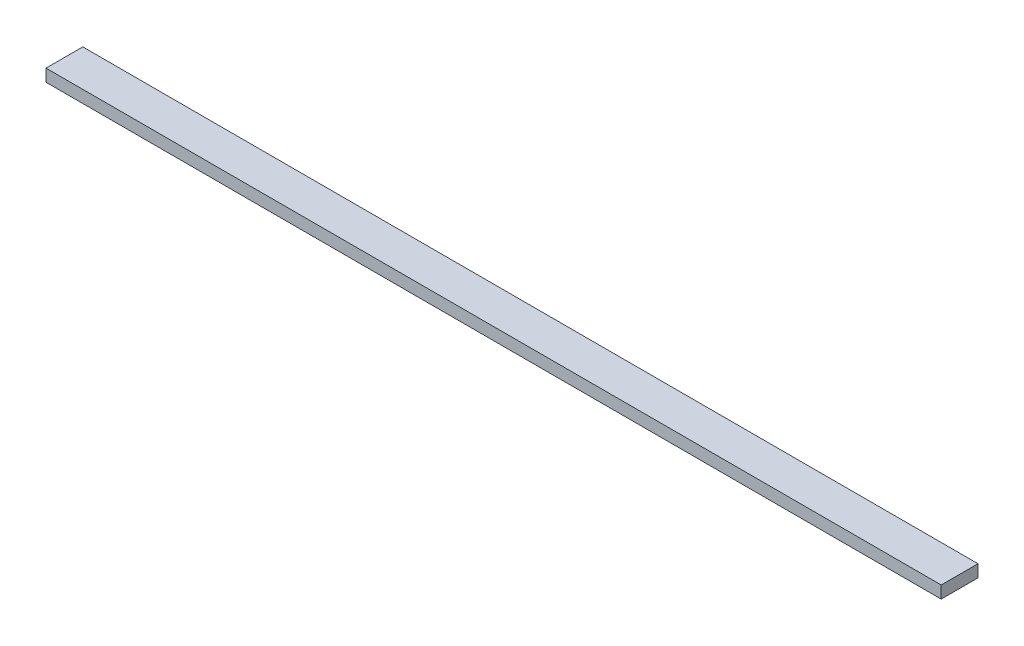
ISO-10303-21;
HEADER;
FILE_DESCRIPTION(('STEP AP214'),'2;1');
FILE_NAME('part.step','',(''),(''),'','','');
FILE_SCHEMA(('AUTOMOTIVE_DESIGN { 1 0 10303 214 1 1 1 1 }'));
ENDSEC;
DATA;
#1=APPLICATION_CONTEXT('core data for automotive mechanical design processes');
#2=APPLICATION_PROTOCOL_DEFINITION('international standard','automotive_design',2000,#1);
#3=PRODUCT_CONTEXT('',#1,'mechanical');
#4=PRODUCT('Part','Part','',(#3));
#5=PRODUCT_RELATED_PRODUCT_CATEGORY('part','',(#4));
#6=PRODUCT_DEFINITION_FORMATION('','',#4);
#7=PRODUCT_DEFINITION_CONTEXT('part definition',#1,'design');
#8=PRODUCT_DEFINITION('design','',#6,#7);
#9=PRODUCT_DEFINITION_SHAPE('','',#8);
#10=(LENGTH_UNIT() NAMED_UNIT(*) SI_UNIT(.MILLI.,.METRE.));
#11=(NAMED_UNIT(*) PLANE_ANGLE_UNIT() SI_UNIT($,.RADIAN.));
#12=(NAMED_UNIT(*) SI_UNIT($,.STERADIAN.) SOLID_ANGLE_UNIT());
#13=UNCERTAINTY_MEASURE_WITH_UNIT(LENGTH_MEASURE(1.E-05),#10,'distance_accuracy_value','');
#14=(GEOMETRIC_REPRESENTATION_CONTEXT(3) GLOBAL_UNCERTAINTY_ASSIGNED_CONTEXT((#13)) GLOBAL_UNIT_ASSIGNED_CONTEXT((#10,
#11,#12)) REPRESENTATION_CONTEXT('',''));
#15=CARTESIAN_POINT('',(0.,0.,0.));
#16=DIRECTION('',(0.,0.,1.));
#17=DIRECTION('',(1.,0.,0.));
#18=AXIS2_PLACEMENT_3D('',#15,#16,#17);
#19=CARTESIAN_POINT('',(0.,12.7,0.));
#20=DIRECTION('',(1.,0.,0.));
#21=DIRECTION('',(0.,0.,-1.));
#22=AXIS2_PLACEMENT_3D('',#19,#20,#21);
#23=PLANE('',#22);
#24=DIRECTION('',(0.,0.,1.));
#25=VECTOR('',#24,1.);
#26=CARTESIAN_POINT('',(0.,0.,0.));
#27=LINE('',#26,#25);
#28=CARTESIAN_POINT('',(0.,0.,-38.1));
#29=VERTEX_POINT('',#28);
#30=CARTESIAN_POINT('',(0.,0.,0.));
#31=VERTEX_POINT('',#30);
#32=EDGE_CURVE('E97',#29,#31,#27,.T.);
#33=ORIENTED_EDGE('',*,*,#32,.T.);
#34=DIRECTION('',(0.,-1.,0.));
#35=VECTOR('',#34,1.);
#36=CARTESIAN_POINT('',(0.,12.7,0.));
#37=LINE('',#36,#35);
#38=CARTESIAN_POINT('',(0.,12.7,0.));
#39=VERTEX_POINT('',#38);
#40=EDGE_CURVE('E11',#39,#31,#37,.T.);
#41=ORIENTED_EDGE('',*,*,#40,.F.);
#42=DIRECTION('',(0.,0.,1.));
#43=VECTOR('',#42,1.);
#44=CARTESIAN_POINT('',(0.,12.7,0.));
#45=LINE('',#44,#43);
#46=CARTESIAN_POINT('',(0.,12.7,-38.1));
#47=VERTEX_POINT('',#46);
#48=EDGE_CURVE('E85',#47,#39,#45,.T.);
#49=ORIENTED_EDGE('',*,*,#48,.F.);
#50=DIRECTION('',(0.,-1.,0.));
#51=VECTOR('',#50,1.);
#52=CARTESIAN_POINT('',(0.,12.7,-38.1));
#53=LINE('',#52,#51);
#54=EDGE_CURVE('E93',#47,#29,#53,.T.);
#55=ORIENTED_EDGE('',*,*,#54,.T.);
#56=EDGE_LOOP('',(#33,#41,#49,#55));
#57=FACE_BOUND('',#56,.T.);
#58=ADVANCED_FACE('F34',(#57),#23,.F.);
#59=CARTESIAN_POINT('',(0.,12.7,0.));
#60=DIRECTION('',(0.,0.,-1.));
#61=DIRECTION('',(-1.,0.,0.));
#62=AXIS2_PLACEMENT_3D('',#59,#60,#61);
#63=PLANE('',#62);
#64=DIRECTION('',(1.,0.,0.));
#65=VECTOR('',#64,1.);
#66=CARTESIAN_POINT('',(0.,0.,0.));
#67=LINE('',#66,#65);
#68=CARTESIAN_POINT('',(927.1,0.,0.));
#69=VERTEX_POINT('',#68);
#70=EDGE_CURVE('E89',#31,#69,#67,.T.);
#71=ORIENTED_EDGE('',*,*,#70,.T.);
#72=DIRECTION('',(0.,-1.,0.));
#73=VECTOR('',#72,1.);
#74=CARTESIAN_POINT('',(927.1,12.7,0.));
#75=LINE('',#74,#73);
#76=CARTESIAN_POINT('',(927.1,12.7,0.));
#77=VERTEX_POINT('',#76);
#78=EDGE_CURVE('E42',#77,#69,#75,.T.);
#79=ORIENTED_EDGE('',*,*,#78,.F.);
#80=DIRECTION('',(1.,0.,0.));
#81=VECTOR('',#80,1.);
#82=CARTESIAN_POINT('',(0.,12.7,0.));
#83=LINE('',#82,#81);
#84=EDGE_CURVE('E80',#39,#77,#83,.T.);
#85=ORIENTED_EDGE('',*,*,#84,.F.);
#86=ORIENTED_EDGE('',*,*,#40,.T.);
#87=EDGE_LOOP('',(#71,#79,#85,#86));
#88=FACE_BOUND('',#87,.T.);
#89=ADVANCED_FACE('F88',(#88),#63,.F.);
#90=CARTESIAN_POINT('',(927.1,12.7,0.));
#91=DIRECTION('',(-1.,0.,0.));
#92=DIRECTION('',(0.,0.,1.));
#93=AXIS2_PLACEMENT_3D('',#90,#91,#92);
#94=PLANE('',#93);
#95=DIRECTION('',(0.,0.,-1.));
#96=VECTOR('',#95,1.);
#97=CARTESIAN_POINT('',(927.1,0.,0.));
#98=LINE('',#97,#96);
#99=CARTESIAN_POINT('',(927.1,0.,-38.1));
#100=VERTEX_POINT('',#99);
#101=EDGE_CURVE('E67',#69,#100,#98,.T.);
#102=ORIENTED_EDGE('',*,*,#101,.T.);
#103=DIRECTION('',(0.,-1.,0.));
#104=VECTOR('',#103,1.);
#105=CARTESIAN_POINT('',(927.1,12.7,-38.1));
#106=LINE('',#105,#104);
#107=CARTESIAN_POINT('',(927.1,12.7,-38.1));
#108=VERTEX_POINT('',#107);
#109=EDGE_CURVE('E90',#108,#100,#106,.T.);
#110=ORIENTED_EDGE('',*,*,#109,.F.);
#111=DIRECTION('',(0.,0.,-1.));
#112=VECTOR('',#111,1.);
#113=CARTESIAN_POINT('',(927.1,12.7,0.));
#114=LINE('',#113,#112);
#115=EDGE_CURVE('E83',#77,#108,#114,.T.);
#116=ORIENTED_EDGE('',*,*,#115,.F.);
#117=ORIENTED_EDGE('',*,*,#78,.T.);
#118=EDGE_LOOP('',(#102,#110,#116,#117));
#119=FACE_BOUND('',#118,.T.);
#120=ADVANCED_FACE('F91',(#119),#94,.F.);
#121=CARTESIAN_POINT('',(0.,12.7,-38.1));
#122=DIRECTION('',(0.,0.,1.));
#123=DIRECTION('',(1.,0.,0.));
#124=AXIS2_PLACEMENT_3D('',#121,#122,#123);
#125=PLANE('',#124);
#126=DIRECTION('',(-1.,0.,0.));
#127=VECTOR('',#126,1.);
#128=CARTESIAN_POINT('',(0.,0.,-38.1));
#129=LINE('',#128,#127);
#130=EDGE_CURVE('E73',#100,#29,#129,.T.);
#131=ORIENTED_EDGE('',*,*,#130,.T.);
#132=ORIENTED_EDGE('',*,*,#54,.F.);
#133=DIRECTION('',(-1.,0.,0.));
#134=VECTOR('',#133,1.);
#135=CARTESIAN_POINT('',(0.,12.7,-38.1));
#136=LINE('',#135,#134);
#137=EDGE_CURVE('E50',#108,#47,#136,.T.);
#138=ORIENTED_EDGE('',*,*,#137,.F.);
#139=ORIENTED_EDGE('',*,*,#109,.T.);
#140=EDGE_LOOP('',(#131,#132,#138,#139));
#141=FACE_BOUND('',#140,.T.);
#142=ADVANCED_FACE('F104',(#141),#125,.F.);
#143=CARTESIAN_POINT('',(0.,12.7,0.));
#144=DIRECTION('',(0.,-1.,0.));
#145=DIRECTION('',(0.,0.,-1.));
#146=AXIS2_PLACEMENT_3D('',#143,#144,#145);
#147=PLANE('',#146);
#148=ORIENTED_EDGE('',*,*,#48,.T.);
#149=ORIENTED_EDGE('',*,*,#84,.T.);
#150=ORIENTED_EDGE('',*,*,#115,.T.);
#151=ORIENTED_EDGE('',*,*,#137,.T.);
#152=EDGE_LOOP('',(#148,#149,#150,#151));
#153=FACE_BOUND('',#152,.T.);
#154=ADVANCED_FACE('F81',(#153),#147,.F.);
#155=CARTESIAN_POINT('',(0.,0.,0.));
#156=DIRECTION('',(0.,-1.,0.));
#157=DIRECTION('',(0.,0.,-1.));
#158=AXIS2_PLACEMENT_3D('',#155,#156,#157);
#159=PLANE('',#158);
#160=ORIENTED_EDGE('',*,*,#32,.F.);
#161=ORIENTED_EDGE('',*,*,#130,.F.);
#162=ORIENTED_EDGE('',*,*,#101,.F.);
#163=ORIENTED_EDGE('',*,*,#70,.F.);
#164=EDGE_LOOP('',(#160,#161,#162,#163));
#165=FACE_BOUND('',#164,.T.);
#166=ADVANCED_FACE('F107',(#165),#159,.T.);
#167=CLOSED_SHELL('',(#58,#89,#120,#142,#154,#166));
#168=MANIFOLD_SOLID_BREP('B2',#167);
#169=ADVANCED_BREP_SHAPE_REPRESENTATION('',(#18,#168),#14);
#170=SHAPE_DEFINITION_REPRESENTATION(#9,#169);
ENDSEC;
END-ISO-10303-21;
